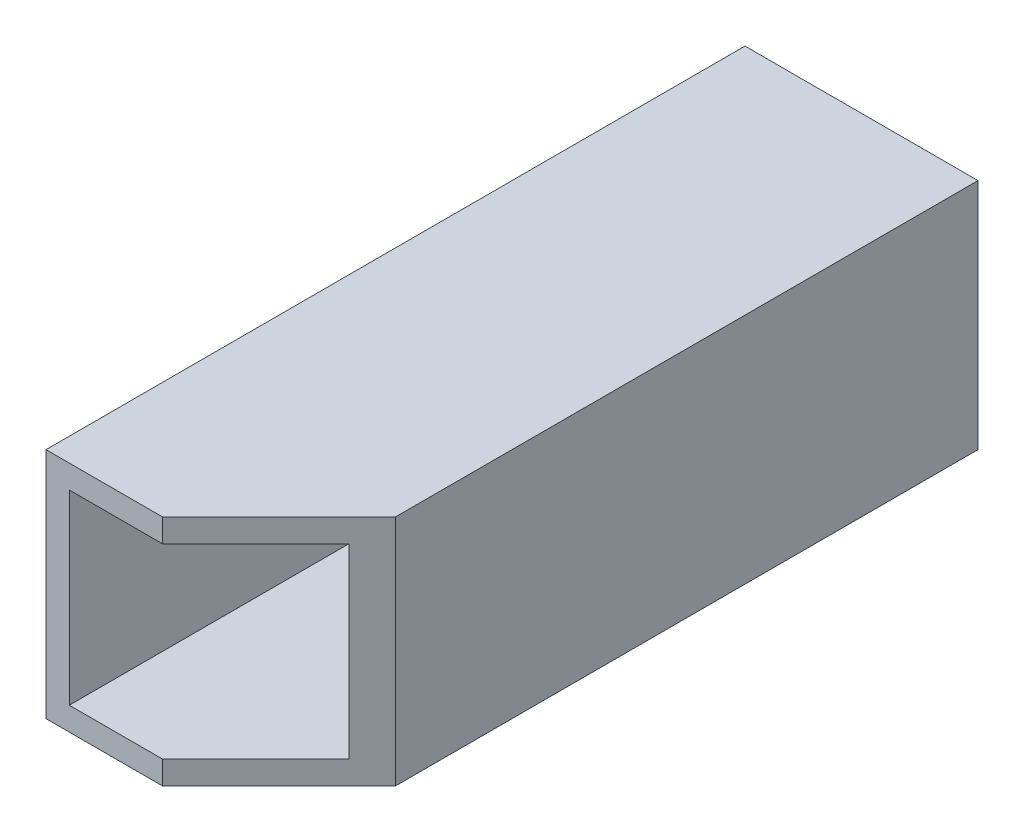
ISO-10303-21;
HEADER;
FILE_DESCRIPTION(('STEP AP214'),'2;1');
FILE_NAME('part.step','',(''),(''),'','','');
FILE_SCHEMA(('AUTOMOTIVE_DESIGN { 1 0 10303 214 1 1 1 1 }'));
ENDSEC;
DATA;
#1=APPLICATION_CONTEXT('core data for automotive mechanical design processes');
#2=APPLICATION_PROTOCOL_DEFINITION('international standard','automotive_design',2000,#1);
#3=PRODUCT_CONTEXT('',#1,'mechanical');
#4=PRODUCT('Part','Part','',(#3));
#5=PRODUCT_RELATED_PRODUCT_CATEGORY('part','',(#4));
#6=PRODUCT_DEFINITION_FORMATION('','',#4);
#7=PRODUCT_DEFINITION_CONTEXT('part definition',#1,'design');
#8=PRODUCT_DEFINITION('design','',#6,#7);
#9=PRODUCT_DEFINITION_SHAPE('','',#8);
#10=(LENGTH_UNIT() NAMED_UNIT(*) SI_UNIT(.MILLI.,.METRE.));
#11=(NAMED_UNIT(*) PLANE_ANGLE_UNIT() SI_UNIT($,.RADIAN.));
#12=(NAMED_UNIT(*) SI_UNIT($,.STERADIAN.) SOLID_ANGLE_UNIT());
#13=UNCERTAINTY_MEASURE_WITH_UNIT(LENGTH_MEASURE(1.E-05),#10,'distance_accuracy_value','');
#14=(GEOMETRIC_REPRESENTATION_CONTEXT(3) GLOBAL_UNCERTAINTY_ASSIGNED_CONTEXT((#13)) GLOBAL_UNIT_ASSIGNED_CONTEXT((#10,
#11,#12)) REPRESENTATION_CONTEXT('',''));
#15=CARTESIAN_POINT('',(0.,0.,0.));
#16=DIRECTION('',(0.,0.,1.));
#17=DIRECTION('',(1.,0.,0.));
#18=AXIS2_PLACEMENT_3D('',#15,#16,#17);
#19=CARTESIAN_POINT('',(-25.,25.,150.));
#20=DIRECTION('',(-1.,0.,0.));
#21=DIRECTION('',(0.,0.,1.));
#22=AXIS2_PLACEMENT_3D('',#19,#20,#21);
#23=PLANE('',#22);
#24=DIRECTION('',(0.,1.,0.));
#25=VECTOR('',#24,1.);
#26=CARTESIAN_POINT('',(-25.,25.,0.));
#27=LINE('',#26,#25);
#28=CARTESIAN_POINT('',(-25.,-25.,0.));
#29=VERTEX_POINT('',#28);
#30=CARTESIAN_POINT('',(-25.,25.,0.));
#31=VERTEX_POINT('',#30);
#32=EDGE_CURVE('E144',#29,#31,#27,.T.);
#33=ORIENTED_EDGE('',*,*,#32,.F.);
#34=DIRECTION('',(0.,0.,-1.));
#35=VECTOR('',#34,1.);
#36=CARTESIAN_POINT('',(-25.,-25.,150.));
#37=LINE('',#36,#35);
#38=CARTESIAN_POINT('',(-25.,-25.,150.));
#39=VERTEX_POINT('',#38);
#40=EDGE_CURVE('E43',#39,#29,#37,.T.);
#41=ORIENTED_EDGE('',*,*,#40,.F.);
#42=DIRECTION('',(0.,1.,0.));
#43=VECTOR('',#42,1.);
#44=CARTESIAN_POINT('',(-25.,25.,150.));
#45=LINE('',#44,#43);
#46=CARTESIAN_POINT('',(-25.,25.,150.));
#47=VERTEX_POINT('',#46);
#48=EDGE_CURVE('E137',#39,#47,#45,.T.);
#49=ORIENTED_EDGE('',*,*,#48,.T.);
#50=DIRECTION('',(0.,0.,-1.));
#51=VECTOR('',#50,1.);
#52=CARTESIAN_POINT('',(-25.,25.,150.));
#53=LINE('',#52,#51);
#54=EDGE_CURVE('E135',#47,#31,#53,.T.);
#55=ORIENTED_EDGE('',*,*,#54,.T.);
#56=EDGE_LOOP('',(#33,#41,#49,#55));
#57=FACE_BOUND('',#56,.T.);
#58=ADVANCED_FACE('F36',(#57),#23,.T.);
#59=CARTESIAN_POINT('',(-25.,-25.,150.));
#60=DIRECTION('',(0.,-1.,0.));
#61=DIRECTION('',(0.,0.,-1.));
#62=AXIS2_PLACEMENT_3D('',#59,#60,#61);
#63=PLANE('',#62);
#64=DIRECTION('',(0.707106781186552,0.,-0.707106781186544));
#65=VECTOR('',#64,1.);
#66=CARTESIAN_POINT('',(0.,-25.,150.));
#67=LINE('',#66,#65);
#68=CARTESIAN_POINT('',(0.,-25.,150.));
#69=VERTEX_POINT('',#68);
#70=CARTESIAN_POINT('',(25.,-25.,125.));
#71=VERTEX_POINT('',#70);
#72=EDGE_CURVE('E120',#69,#71,#67,.T.);
#73=ORIENTED_EDGE('',*,*,#72,.F.);
#74=DIRECTION('',(-1.,0.,0.));
#75=VECTOR('',#74,1.);
#76=CARTESIAN_POINT('',(-25.,-25.,150.));
#77=LINE('',#76,#75);
#78=EDGE_CURVE('E136',#69,#39,#77,.T.);
#79=ORIENTED_EDGE('',*,*,#78,.T.);
#80=ORIENTED_EDGE('',*,*,#40,.T.);
#81=DIRECTION('',(-1.,0.,0.));
#82=VECTOR('',#81,1.);
#83=CARTESIAN_POINT('',(-25.,-25.,0.));
#84=LINE('',#83,#82);
#85=CARTESIAN_POINT('',(25.,-25.,0.));
#86=VERTEX_POINT('',#85);
#87=EDGE_CURVE('E140',#86,#29,#84,.T.);
#88=ORIENTED_EDGE('',*,*,#87,.F.);
#89=DIRECTION('',(0.,0.,-1.));
#90=VECTOR('',#89,1.);
#91=CARTESIAN_POINT('',(25.,-25.,150.));
#92=LINE('',#91,#90);
#93=EDGE_CURVE('E157',#71,#86,#92,.T.);
#94=ORIENTED_EDGE('',*,*,#93,.F.);
#95=EDGE_LOOP('',(#73,#79,#80,#88,#94));
#96=FACE_BOUND('',#95,.T.);
#97=ADVANCED_FACE('F170',(#96),#63,.T.);
#98=CARTESIAN_POINT('',(25.,25.,150.));
#99=DIRECTION('',(1.,0.,0.));
#100=DIRECTION('',(0.,0.,-1.));
#101=AXIS2_PLACEMENT_3D('',#98,#99,#100);
#102=PLANE('',#101);
#103=DIRECTION('',(0.,-1.,0.));
#104=VECTOR('',#103,1.);
#105=CARTESIAN_POINT('',(25.,25.,125.));
#106=LINE('',#105,#104);
#107=CARTESIAN_POINT('',(25.,25.,125.));
#108=VERTEX_POINT('',#107);
#109=EDGE_CURVE('E115',#108,#71,#106,.T.);
#110=ORIENTED_EDGE('',*,*,#109,.T.);
#111=ORIENTED_EDGE('',*,*,#93,.T.);
#112=DIRECTION('',(0.,-1.,0.));
#113=VECTOR('',#112,1.);
#114=CARTESIAN_POINT('',(25.,25.,0.));
#115=LINE('',#114,#113);
#116=CARTESIAN_POINT('',(25.,25.,0.));
#117=VERTEX_POINT('',#116);
#118=EDGE_CURVE('E151',#117,#86,#115,.T.);
#119=ORIENTED_EDGE('',*,*,#118,.F.);
#120=DIRECTION('',(0.,0.,-1.));
#121=VECTOR('',#120,1.);
#122=CARTESIAN_POINT('',(25.,25.,150.));
#123=LINE('',#122,#121);
#124=EDGE_CURVE('E159',#108,#117,#123,.T.);
#125=ORIENTED_EDGE('',*,*,#124,.F.);
#126=EDGE_LOOP('',(#110,#111,#119,#125));
#127=FACE_BOUND('',#126,.T.);
#128=ADVANCED_FACE('F216',(#127),#102,.T.);
#129=CARTESIAN_POINT('',(-25.,25.,150.));
#130=DIRECTION('',(0.,1.,0.));
#131=DIRECTION('',(0.,0.,1.));
#132=AXIS2_PLACEMENT_3D('',#129,#130,#131);
#133=PLANE('',#132);
#134=DIRECTION('',(0.707106781186552,0.,-0.707106781186544));
#135=VECTOR('',#134,1.);
#136=CARTESIAN_POINT('',(0.,25.,150.));
#137=LINE('',#136,#135);
#138=CARTESIAN_POINT('',(0.,25.,150.));
#139=VERTEX_POINT('',#138);
#140=EDGE_CURVE('E110',#139,#108,#137,.T.);
#141=ORIENTED_EDGE('',*,*,#140,.T.);
#142=ORIENTED_EDGE('',*,*,#124,.T.);
#143=DIRECTION('',(1.,0.,0.));
#144=VECTOR('',#143,1.);
#145=CARTESIAN_POINT('',(-25.,25.,0.));
#146=LINE('',#145,#144);
#147=EDGE_CURVE('E147',#31,#117,#146,.T.);
#148=ORIENTED_EDGE('',*,*,#147,.F.);
#149=ORIENTED_EDGE('',*,*,#54,.F.);
#150=DIRECTION('',(1.,0.,0.));
#151=VECTOR('',#150,1.);
#152=CARTESIAN_POINT('',(-25.,25.,150.));
#153=LINE('',#152,#151);
#154=EDGE_CURVE('E127',#47,#139,#153,.T.);
#155=ORIENTED_EDGE('',*,*,#154,.T.);
#156=EDGE_LOOP('',(#141,#142,#148,#149,#155));
#157=FACE_BOUND('',#156,.T.);
#158=ADVANCED_FACE('F133',(#157),#133,.T.);
#159=CARTESIAN_POINT('',(0.,0.,150.));
#160=DIRECTION('',(0.,0.,1.));
#161=DIRECTION('',(1.,0.,0.));
#162=AXIS2_PLACEMENT_3D('',#159,#160,#161);
#163=PLANE('',#162);
#164=DIRECTION('',(0.,-1.,0.));
#165=VECTOR('',#164,1.);
#166=CARTESIAN_POINT('',(0.,25.,150.));
#167=LINE('',#166,#165);
#168=CARTESIAN_POINT('',(0.,20.,150.));
#169=VERTEX_POINT('',#168);
#170=EDGE_CURVE('E113',#139,#169,#167,.T.);
#171=ORIENTED_EDGE('',*,*,#170,.F.);
#172=ORIENTED_EDGE('',*,*,#154,.F.);
#173=ORIENTED_EDGE('',*,*,#48,.F.);
#174=ORIENTED_EDGE('',*,*,#78,.F.);
#175=CARTESIAN_POINT('',(0.,-20.,150.));
#176=VERTEX_POINT('',#175);
#177=EDGE_CURVE('E119',#176,#69,#167,.T.);
#178=ORIENTED_EDGE('',*,*,#177,.F.);
#179=DIRECTION('',(-1.,0.,0.));
#180=VECTOR('',#179,1.);
#181=CARTESIAN_POINT('',(-20.,-20.,150.));
#182=LINE('',#181,#180);
#183=CARTESIAN_POINT('',(-20.,-20.,150.));
#184=VERTEX_POINT('',#183);
#185=EDGE_CURVE('E174',#176,#184,#182,.T.);
#186=ORIENTED_EDGE('',*,*,#185,.T.);
#187=DIRECTION('',(0.,1.,0.));
#188=VECTOR('',#187,1.);
#189=CARTESIAN_POINT('',(-20.,20.,150.));
#190=LINE('',#189,#188);
#191=CARTESIAN_POINT('',(-20.,20.,150.));
#192=VERTEX_POINT('',#191);
#193=EDGE_CURVE('E184',#184,#192,#190,.T.);
#194=ORIENTED_EDGE('',*,*,#193,.T.);
#195=DIRECTION('',(1.,0.,0.));
#196=VECTOR('',#195,1.);
#197=CARTESIAN_POINT('',(-20.,20.,150.));
#198=LINE('',#197,#196);
#199=EDGE_CURVE('E131',#192,#169,#198,.T.);
#200=ORIENTED_EDGE('',*,*,#199,.T.);
#201=EDGE_LOOP('',(#171,#172,#173,#174,#178,#186,#194,#200));
#202=FACE_BOUND('',#201,.T.);
#203=ADVANCED_FACE('F125',(#202),#163,.T.);
#204=CARTESIAN_POINT('',(0.,0.,0.));
#205=DIRECTION('',(0.,0.,1.));
#206=DIRECTION('',(1.,0.,0.));
#207=AXIS2_PLACEMENT_3D('',#204,#205,#206);
#208=PLANE('',#207);
#209=DIRECTION('',(0.,-1.,0.));
#210=VECTOR('',#209,1.);
#211=CARTESIAN_POINT('',(20.,20.,0.));
#212=LINE('',#211,#210);
#213=CARTESIAN_POINT('',(20.,20.,0.));
#214=VERTEX_POINT('',#213);
#215=CARTESIAN_POINT('',(20.,-20.,0.));
#216=VERTEX_POINT('',#215);
#217=EDGE_CURVE('E193',#214,#216,#212,.T.);
#218=ORIENTED_EDGE('',*,*,#217,.F.);
#219=DIRECTION('',(1.,0.,0.));
#220=VECTOR('',#219,1.);
#221=CARTESIAN_POINT('',(-20.,20.,0.));
#222=LINE('',#221,#220);
#223=CARTESIAN_POINT('',(-20.,20.,0.));
#224=VERTEX_POINT('',#223);
#225=EDGE_CURVE('E191',#224,#214,#222,.T.);
#226=ORIENTED_EDGE('',*,*,#225,.F.);
#227=DIRECTION('',(0.,1.,0.));
#228=VECTOR('',#227,1.);
#229=CARTESIAN_POINT('',(-20.,20.,0.));
#230=LINE('',#229,#228);
#231=CARTESIAN_POINT('',(-20.,-20.,0.));
#232=VERTEX_POINT('',#231);
#233=EDGE_CURVE('E187',#232,#224,#230,.T.);
#234=ORIENTED_EDGE('',*,*,#233,.F.);
#235=DIRECTION('',(-1.,0.,0.));
#236=VECTOR('',#235,1.);
#237=CARTESIAN_POINT('',(-20.,-20.,0.));
#238=LINE('',#237,#236);
#239=EDGE_CURVE('E195',#216,#232,#238,.T.);
#240=ORIENTED_EDGE('',*,*,#239,.F.);
#241=EDGE_LOOP('',(#218,#226,#234,#240));
#242=FACE_BOUND('',#241,.T.);
#243=ORIENTED_EDGE('',*,*,#32,.T.);
#244=ORIENTED_EDGE('',*,*,#147,.T.);
#245=ORIENTED_EDGE('',*,*,#118,.T.);
#246=ORIENTED_EDGE('',*,*,#87,.T.);
#247=EDGE_LOOP('',(#243,#244,#245,#246));
#248=FACE_BOUND('',#247,.T.);
#249=ADVANCED_FACE('F165',(#242,#248),#208,.F.);
#250=CARTESIAN_POINT('',(-20.,20.,150.));
#251=DIRECTION('',(0.,1.,0.));
#252=DIRECTION('',(0.,0.,1.));
#253=AXIS2_PLACEMENT_3D('',#250,#251,#252);
#254=PLANE('',#253);
#255=DIRECTION('',(0.,0.,-1.));
#256=VECTOR('',#255,1.);
#257=CARTESIAN_POINT('',(20.,20.,150.));
#258=LINE('',#257,#256);
#259=CARTESIAN_POINT('',(20.,20.,130.));
#260=VERTEX_POINT('',#259);
#261=EDGE_CURVE('E56',#260,#214,#258,.T.);
#262=ORIENTED_EDGE('',*,*,#261,.F.);
#263=DIRECTION('',(-0.707106781186551,0.,0.707106781186544));
#264=VECTOR('',#263,1.);
#265=CARTESIAN_POINT('',(-10.0000000000001,20.,160.));
#266=LINE('',#265,#264);
#267=EDGE_CURVE('E50',#260,#169,#266,.T.);
#268=ORIENTED_EDGE('',*,*,#267,.T.);
#269=ORIENTED_EDGE('',*,*,#199,.F.);
#270=DIRECTION('',(0.,0.,-1.));
#271=VECTOR('',#270,1.);
#272=CARTESIAN_POINT('',(-20.,20.,150.));
#273=LINE('',#272,#271);
#274=EDGE_CURVE('E148',#192,#224,#273,.T.);
#275=ORIENTED_EDGE('',*,*,#274,.T.);
#276=ORIENTED_EDGE('',*,*,#225,.T.);
#277=EDGE_LOOP('',(#262,#268,#269,#275,#276));
#278=FACE_BOUND('',#277,.T.);
#279=ADVANCED_FACE('F211',(#278),#254,.F.);
#280=CARTESIAN_POINT('',(-20.,20.,150.));
#281=DIRECTION('',(-1.,0.,0.));
#282=DIRECTION('',(0.,0.,1.));
#283=AXIS2_PLACEMENT_3D('',#280,#281,#282);
#284=PLANE('',#283);
#285=ORIENTED_EDGE('',*,*,#233,.T.);
#286=ORIENTED_EDGE('',*,*,#274,.F.);
#287=ORIENTED_EDGE('',*,*,#193,.F.);
#288=DIRECTION('',(0.,0.,-1.));
#289=VECTOR('',#288,1.);
#290=CARTESIAN_POINT('',(-20.,-20.,150.));
#291=LINE('',#290,#289);
#292=EDGE_CURVE('E182',#184,#232,#291,.T.);
#293=ORIENTED_EDGE('',*,*,#292,.T.);
#294=EDGE_LOOP('',(#285,#286,#287,#293));
#295=FACE_BOUND('',#294,.T.);
#296=ADVANCED_FACE('F209',(#295),#284,.F.);
#297=CARTESIAN_POINT('',(-20.,-20.,150.));
#298=DIRECTION('',(0.,-1.,0.));
#299=DIRECTION('',(0.,0.,-1.));
#300=AXIS2_PLACEMENT_3D('',#297,#298,#299);
#301=PLANE('',#300);
#302=ORIENTED_EDGE('',*,*,#185,.F.);
#303=DIRECTION('',(0.707106781186551,0.,-0.707106781186544));
#304=VECTOR('',#303,1.);
#305=CARTESIAN_POINT('',(-10.0000000000001,-20.,160.));
#306=LINE('',#305,#304);
#307=CARTESIAN_POINT('',(20.,-20.,130.));
#308=VERTEX_POINT('',#307);
#309=EDGE_CURVE('E179',#176,#308,#306,.T.);
#310=ORIENTED_EDGE('',*,*,#309,.T.);
#311=DIRECTION('',(0.,0.,-1.));
#312=VECTOR('',#311,1.);
#313=CARTESIAN_POINT('',(20.,-20.,150.));
#314=LINE('',#313,#312);
#315=EDGE_CURVE('E201',#308,#216,#314,.T.);
#316=ORIENTED_EDGE('',*,*,#315,.T.);
#317=ORIENTED_EDGE('',*,*,#239,.T.);
#318=ORIENTED_EDGE('',*,*,#292,.F.);
#319=EDGE_LOOP('',(#302,#310,#316,#317,#318));
#320=FACE_BOUND('',#319,.T.);
#321=ADVANCED_FACE('F178',(#320),#301,.F.);
#322=CARTESIAN_POINT('',(20.,20.,150.));
#323=DIRECTION('',(1.,0.,0.));
#324=DIRECTION('',(0.,0.,-1.));
#325=AXIS2_PLACEMENT_3D('',#322,#323,#324);
#326=PLANE('',#325);
#327=ORIENTED_EDGE('',*,*,#315,.F.);
#328=DIRECTION('',(0.,1.,0.));
#329=VECTOR('',#328,1.);
#330=CARTESIAN_POINT('',(20.,20.,130.));
#331=LINE('',#330,#329);
#332=EDGE_CURVE('E11',#308,#260,#331,.T.);
#333=ORIENTED_EDGE('',*,*,#332,.T.);
#334=ORIENTED_EDGE('',*,*,#261,.T.);
#335=ORIENTED_EDGE('',*,*,#217,.T.);
#336=EDGE_LOOP('',(#327,#333,#334,#335));
#337=FACE_BOUND('',#336,.T.);
#338=ADVANCED_FACE('F205',(#337),#326,.F.);
#339=CARTESIAN_POINT('',(0.,25.,150.));
#340=DIRECTION('',(-0.707106781186544,0.,-0.707106781186552));
#341=DIRECTION('',(-0.707106781186551,0.,0.707106781186544));
#342=AXIS2_PLACEMENT_3D('',#339,#340,#341);
#343=PLANE('',#342);
#344=ORIENTED_EDGE('',*,*,#332,.F.);
#345=ORIENTED_EDGE('',*,*,#309,.F.);
#346=ORIENTED_EDGE('',*,*,#177,.T.);
#347=ORIENTED_EDGE('',*,*,#72,.T.);
#348=ORIENTED_EDGE('',*,*,#109,.F.);
#349=ORIENTED_EDGE('',*,*,#140,.F.);
#350=ORIENTED_EDGE('',*,*,#170,.T.);
#351=ORIENTED_EDGE('',*,*,#267,.F.);
#352=EDGE_LOOP('',(#344,#345,#346,#347,#348,#349,#350,#351));
#353=FACE_BOUND('',#352,.T.);
#354=ADVANCED_FACE('F112',(#353),#343,.F.);
#355=CLOSED_SHELL('',(#58,#97,#128,#158,#203,#249,#279,#296,#321,#338,#354));
#356=MANIFOLD_SOLID_BREP('B2',#355);
#357=ADVANCED_BREP_SHAPE_REPRESENTATION('',(#18,#356),#14);
#358=SHAPE_DEFINITION_REPRESENTATION(#9,#357);
ENDSEC;
END-ISO-10303-21;
